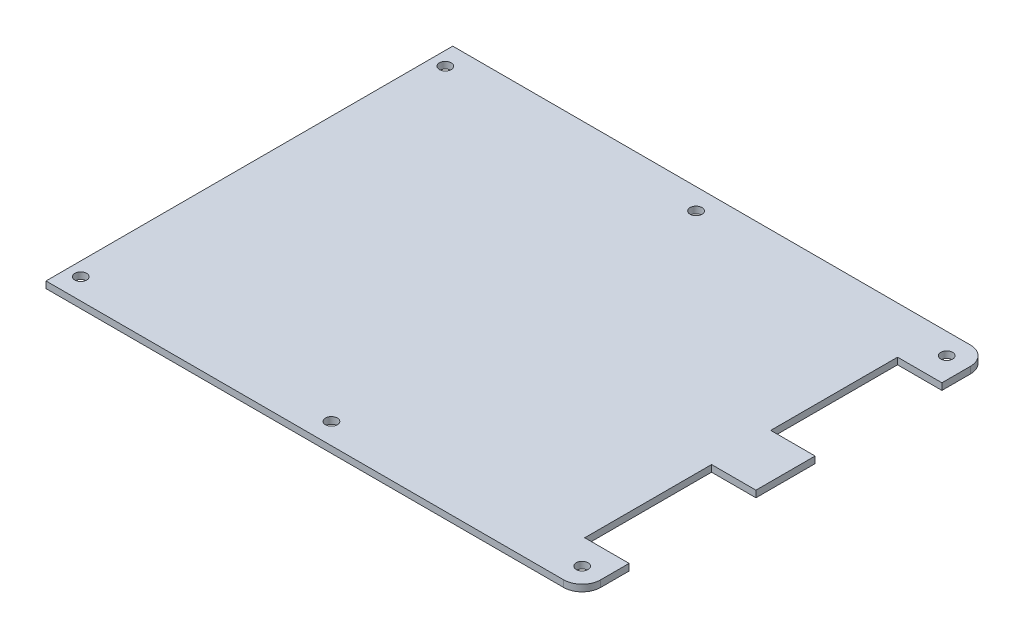
ISO-10303-21;
HEADER;
FILE_DESCRIPTION(('STEP AP214'),'2;1');
FILE_NAME('part.step','',(''),(''),'','','');
FILE_SCHEMA(('AUTOMOTIVE_DESIGN { 1 0 10303 214 1 1 1 1 }'));
ENDSEC;
DATA;
#1=APPLICATION_CONTEXT('core data for automotive mechanical design processes');
#2=APPLICATION_PROTOCOL_DEFINITION('international standard','automotive_design',2000,#1);
#3=PRODUCT_CONTEXT('',#1,'mechanical');
#4=PRODUCT('Part','Part','',(#3));
#5=PRODUCT_RELATED_PRODUCT_CATEGORY('part','',(#4));
#6=PRODUCT_DEFINITION_FORMATION('','',#4);
#7=PRODUCT_DEFINITION_CONTEXT('part definition',#1,'design');
#8=PRODUCT_DEFINITION('design','',#6,#7);
#9=PRODUCT_DEFINITION_SHAPE('','',#8);
#10=(LENGTH_UNIT() NAMED_UNIT(*) SI_UNIT(.MILLI.,.METRE.));
#11=(NAMED_UNIT(*) PLANE_ANGLE_UNIT() SI_UNIT($,.RADIAN.));
#12=(NAMED_UNIT(*) SI_UNIT($,.STERADIAN.) SOLID_ANGLE_UNIT());
#13=UNCERTAINTY_MEASURE_WITH_UNIT(LENGTH_MEASURE(1.E-05),#10,'distance_accuracy_value','');
#14=(GEOMETRIC_REPRESENTATION_CONTEXT(3) GLOBAL_UNCERTAINTY_ASSIGNED_CONTEXT((#13)) GLOBAL_UNIT_ASSIGNED_CONTEXT((#10,
#11,#12)) REPRESENTATION_CONTEXT('',''));
#15=CARTESIAN_POINT('',(0.,0.,0.));
#16=DIRECTION('',(0.,0.,1.));
#17=DIRECTION('',(1.,0.,0.));
#18=AXIS2_PLACEMENT_3D('',#15,#16,#17);
#19=CARTESIAN_POINT('',(72.5,1.8,-42.3));
#20=DIRECTION('',(-1.,0.,0.));
#21=DIRECTION('',(0.,0.,1.));
#22=AXIS2_PLACEMENT_3D('',#19,#20,#21);
#23=PLANE('',#22);
#24=DIRECTION('',(0.,0.,-1.));
#25=VECTOR('',#24,1.);
#26=CARTESIAN_POINT('',(72.5,0.,-42.3));
#27=LINE('',#26,#25);
#28=CARTESIAN_POINT('',(72.5,0.,-42.3));
#29=VERTEX_POINT('',#28);
#30=CARTESIAN_POINT('',(72.5,0.,-50.));
#31=VERTEX_POINT('',#30);
#32=EDGE_CURVE('E180',#29,#31,#27,.T.);
#33=ORIENTED_EDGE('',*,*,#32,.T.);
#34=DIRECTION('',(0.,-1.,0.));
#35=VECTOR('',#34,1.);
#36=CARTESIAN_POINT('',(72.5,1.8,-50.));
#37=LINE('',#36,#35);
#38=CARTESIAN_POINT('',(72.5,1.8,-50.));
#39=VERTEX_POINT('',#38);
#40=EDGE_CURVE('E234',#31,#39,#37,.F.);
#41=ORIENTED_EDGE('',*,*,#40,.T.);
#42=DIRECTION('',(0.,0.,-1.));
#43=VECTOR('',#42,1.);
#44=CARTESIAN_POINT('',(72.5,1.8,-42.3));
#45=LINE('',#44,#43);
#46=CARTESIAN_POINT('',(72.5,1.8,-42.3));
#47=VERTEX_POINT('',#46);
#48=EDGE_CURVE('E144',#47,#39,#45,.T.);
#49=ORIENTED_EDGE('',*,*,#48,.F.);
#50=DIRECTION('',(0.,-1.,0.));
#51=VECTOR('',#50,1.);
#52=CARTESIAN_POINT('',(72.5,1.8,-42.3));
#53=LINE('',#52,#51);
#54=EDGE_CURVE('E179',#47,#29,#53,.T.);
#55=ORIENTED_EDGE('',*,*,#54,.T.);
#56=EDGE_LOOP('',(#33,#41,#49,#55));
#57=FACE_BOUND('',#56,.T.);
#58=ADVANCED_FACE('F33',(#57),#23,.F.);
#59=CARTESIAN_POINT('',(-72.5,1.8,-55.));
#60=DIRECTION('',(0.,0.,1.));
#61=DIRECTION('',(1.,0.,0.));
#62=AXIS2_PLACEMENT_3D('',#59,#60,#61);
#63=PLANE('',#62);
#64=DIRECTION('',(-1.,0.,0.));
#65=VECTOR('',#64,1.);
#66=CARTESIAN_POINT('',(-72.5,1.8,-55.));
#67=LINE('',#66,#65);
#68=CARTESIAN_POINT('',(67.5,1.8,-55.));
#69=VERTEX_POINT('',#68);
#70=CARTESIAN_POINT('',(-72.5,1.8,-55.));
#71=VERTEX_POINT('',#70);
#72=EDGE_CURVE('E132',#69,#71,#67,.T.);
#73=ORIENTED_EDGE('',*,*,#72,.F.);
#74=DIRECTION('',(0.,-1.,0.));
#75=VECTOR('',#74,1.);
#76=CARTESIAN_POINT('',(67.5,1.8,-55.));
#77=LINE('',#76,#75);
#78=CARTESIAN_POINT('',(67.5,0.,-55.));
#79=VERTEX_POINT('',#78);
#80=EDGE_CURVE('E153',#69,#79,#77,.T.);
#81=ORIENTED_EDGE('',*,*,#80,.T.);
#82=DIRECTION('',(-1.,0.,0.));
#83=VECTOR('',#82,1.);
#84=CARTESIAN_POINT('',(-72.5,0.,-55.));
#85=LINE('',#84,#83);
#86=CARTESIAN_POINT('',(-72.5,0.,-55.));
#87=VERTEX_POINT('',#86);
#88=EDGE_CURVE('E150',#79,#87,#85,.T.);
#89=ORIENTED_EDGE('',*,*,#88,.T.);
#90=DIRECTION('',(0.,-1.,0.));
#91=VECTOR('',#90,1.);
#92=CARTESIAN_POINT('',(-72.5,1.8,-55.));
#93=LINE('',#92,#91);
#94=EDGE_CURVE('E147',#71,#87,#93,.T.);
#95=ORIENTED_EDGE('',*,*,#94,.F.);
#96=EDGE_LOOP('',(#73,#81,#89,#95));
#97=FACE_BOUND('',#96,.T.);
#98=ADVANCED_FACE('F148',(#97),#63,.F.);
#99=CARTESIAN_POINT('',(-72.5,1.8,55.));
#100=DIRECTION('',(1.,0.,0.));
#101=DIRECTION('',(0.,0.,-1.));
#102=AXIS2_PLACEMENT_3D('',#99,#100,#101);
#103=PLANE('',#102);
#104=DIRECTION('',(0.,0.,1.));
#105=VECTOR('',#104,1.);
#106=CARTESIAN_POINT('',(-72.5,0.,55.));
#107=LINE('',#106,#105);
#108=CARTESIAN_POINT('',(-72.5,0.,55.));
#109=VERTEX_POINT('',#108);
#110=EDGE_CURVE('E185',#87,#109,#107,.T.);
#111=ORIENTED_EDGE('',*,*,#110,.T.);
#112=DIRECTION('',(0.,-1.,0.));
#113=VECTOR('',#112,1.);
#114=CARTESIAN_POINT('',(-72.5,1.8,55.));
#115=LINE('',#114,#113);
#116=CARTESIAN_POINT('',(-72.5,1.8,55.));
#117=VERTEX_POINT('',#116);
#118=EDGE_CURVE('E154',#117,#109,#115,.T.);
#119=ORIENTED_EDGE('',*,*,#118,.F.);
#120=DIRECTION('',(0.,0.,1.));
#121=VECTOR('',#120,1.);
#122=CARTESIAN_POINT('',(-72.5,1.8,55.));
#123=LINE('',#122,#121);
#124=EDGE_CURVE('E137',#71,#117,#123,.T.);
#125=ORIENTED_EDGE('',*,*,#124,.F.);
#126=ORIENTED_EDGE('',*,*,#94,.T.);
#127=EDGE_LOOP('',(#111,#119,#125,#126));
#128=FACE_BOUND('',#127,.T.);
#129=ADVANCED_FACE('F156',(#128),#103,.F.);
#130=CARTESIAN_POINT('',(-72.5,1.8,55.));
#131=DIRECTION('',(0.,0.,-1.));
#132=DIRECTION('',(-1.,0.,0.));
#133=AXIS2_PLACEMENT_3D('',#130,#131,#132);
#134=PLANE('',#133);
#135=DIRECTION('',(1.,0.,0.));
#136=VECTOR('',#135,1.);
#137=CARTESIAN_POINT('',(-72.5,0.,55.));
#138=LINE('',#137,#136);
#139=CARTESIAN_POINT('',(67.5,0.,55.));
#140=VERTEX_POINT('',#139);
#141=EDGE_CURVE('E187',#109,#140,#138,.T.);
#142=ORIENTED_EDGE('',*,*,#141,.T.);
#143=DIRECTION('',(0.,-1.,0.));
#144=VECTOR('',#143,1.);
#145=CARTESIAN_POINT('',(67.5,1.8,55.));
#146=LINE('',#145,#144);
#147=CARTESIAN_POINT('',(67.5,1.8,55.));
#148=VERTEX_POINT('',#147);
#149=EDGE_CURVE('E11',#140,#148,#146,.F.);
#150=ORIENTED_EDGE('',*,*,#149,.T.);
#151=DIRECTION('',(1.,0.,0.));
#152=VECTOR('',#151,1.);
#153=CARTESIAN_POINT('',(-72.5,1.8,55.));
#154=LINE('',#153,#152);
#155=EDGE_CURVE('E158',#117,#148,#154,.T.);
#156=ORIENTED_EDGE('',*,*,#155,.F.);
#157=ORIENTED_EDGE('',*,*,#118,.T.);
#158=EDGE_LOOP('',(#142,#150,#156,#157));
#159=FACE_BOUND('',#158,.T.);
#160=ADVANCED_FACE('F360',(#159),#134,.F.);
#161=CARTESIAN_POINT('',(72.5,1.8,55.));
#162=DIRECTION('',(-1.,0.,0.));
#163=DIRECTION('',(0.,0.,1.));
#164=AXIS2_PLACEMENT_3D('',#161,#162,#163);
#165=PLANE('',#164);
#166=DIRECTION('',(0.,0.,-1.));
#167=VECTOR('',#166,1.);
#168=CARTESIAN_POINT('',(72.5,1.8,55.));
#169=LINE('',#168,#167);
#170=CARTESIAN_POINT('',(72.5,1.8,50.));
#171=VERTEX_POINT('',#170);
#172=CARTESIAN_POINT('',(72.5,1.8,42.3));
#173=VERTEX_POINT('',#172);
#174=EDGE_CURVE('E160',#171,#173,#169,.T.);
#175=ORIENTED_EDGE('',*,*,#174,.F.);
#176=DIRECTION('',(0.,-1.,0.));
#177=VECTOR('',#176,1.);
#178=CARTESIAN_POINT('',(72.5,1.8,50.));
#179=LINE('',#178,#177);
#180=CARTESIAN_POINT('',(72.5,0.,50.));
#181=VERTEX_POINT('',#180);
#182=EDGE_CURVE('E41',#171,#181,#179,.T.);
#183=ORIENTED_EDGE('',*,*,#182,.T.);
#184=DIRECTION('',(0.,0.,-1.));
#185=VECTOR('',#184,1.);
#186=CARTESIAN_POINT('',(72.5,0.,55.));
#187=LINE('',#186,#185);
#188=CARTESIAN_POINT('',(72.5,0.,42.3));
#189=VERTEX_POINT('',#188);
#190=EDGE_CURVE('E189',#181,#189,#187,.T.);
#191=ORIENTED_EDGE('',*,*,#190,.T.);
#192=DIRECTION('',(0.,-1.,0.));
#193=VECTOR('',#192,1.);
#194=CARTESIAN_POINT('',(72.5,1.8,42.3));
#195=LINE('',#194,#193);
#196=EDGE_CURVE('E225',#173,#189,#195,.T.);
#197=ORIENTED_EDGE('',*,*,#196,.F.);
#198=EDGE_LOOP('',(#175,#183,#191,#197));
#199=FACE_BOUND('',#198,.T.);
#200=ADVANCED_FACE('F241',(#199),#165,.F.);
#201=CARTESIAN_POINT('',(72.5,1.8,42.3));
#202=DIRECTION('',(0.,0.,1.));
#203=DIRECTION('',(1.,0.,0.));
#204=AXIS2_PLACEMENT_3D('',#201,#202,#203);
#205=PLANE('',#204);
#206=DIRECTION('',(-1.,0.,0.));
#207=VECTOR('',#206,1.);
#208=CARTESIAN_POINT('',(72.5,0.,42.3));
#209=LINE('',#208,#207);
#210=CARTESIAN_POINT('',(60.5,0.,42.3));
#211=VERTEX_POINT('',#210);
#212=EDGE_CURVE('E191',#189,#211,#209,.T.);
#213=ORIENTED_EDGE('',*,*,#212,.T.);
#214=DIRECTION('',(0.,-1.,0.));
#215=VECTOR('',#214,1.);
#216=CARTESIAN_POINT('',(60.5,1.8,42.3));
#217=LINE('',#216,#215);
#218=CARTESIAN_POINT('',(60.5,1.8,42.3));
#219=VERTEX_POINT('',#218);
#220=EDGE_CURVE('E222',#219,#211,#217,.T.);
#221=ORIENTED_EDGE('',*,*,#220,.F.);
#222=DIRECTION('',(-1.,0.,0.));
#223=VECTOR('',#222,1.);
#224=CARTESIAN_POINT('',(72.5,1.8,42.3));
#225=LINE('',#224,#223);
#226=EDGE_CURVE('E165',#173,#219,#225,.T.);
#227=ORIENTED_EDGE('',*,*,#226,.F.);
#228=ORIENTED_EDGE('',*,*,#196,.T.);
#229=EDGE_LOOP('',(#213,#221,#227,#228));
#230=FACE_BOUND('',#229,.T.);
#231=ADVANCED_FACE('F252',(#230),#205,.F.);
#232=CARTESIAN_POINT('',(60.5,1.8,42.3));
#233=DIRECTION('',(-1.,0.,0.));
#234=DIRECTION('',(0.,0.,1.));
#235=AXIS2_PLACEMENT_3D('',#232,#233,#234);
#236=PLANE('',#235);
#237=DIRECTION('',(0.,0.,-1.));
#238=VECTOR('',#237,1.);
#239=CARTESIAN_POINT('',(60.5,0.,42.3));
#240=LINE('',#239,#238);
#241=CARTESIAN_POINT('',(60.5,0.,8.));
#242=VERTEX_POINT('',#241);
#243=EDGE_CURVE('E193',#211,#242,#240,.T.);
#244=ORIENTED_EDGE('',*,*,#243,.T.);
#245=DIRECTION('',(0.,-1.,0.));
#246=VECTOR('',#245,1.);
#247=CARTESIAN_POINT('',(60.5,1.8,8.));
#248=LINE('',#247,#246);
#249=CARTESIAN_POINT('',(60.5,1.8,8.));
#250=VERTEX_POINT('',#249);
#251=EDGE_CURVE('E219',#250,#242,#248,.T.);
#252=ORIENTED_EDGE('',*,*,#251,.F.);
#253=DIRECTION('',(0.,0.,-1.));
#254=VECTOR('',#253,1.);
#255=CARTESIAN_POINT('',(60.5,1.8,42.3));
#256=LINE('',#255,#254);
#257=EDGE_CURVE('E167',#219,#250,#256,.T.);
#258=ORIENTED_EDGE('',*,*,#257,.F.);
#259=ORIENTED_EDGE('',*,*,#220,.T.);
#260=EDGE_LOOP('',(#244,#252,#258,#259));
#261=FACE_BOUND('',#260,.T.);
#262=ADVANCED_FACE('F256',(#261),#236,.F.);
#263=CARTESIAN_POINT('',(72.5,1.8,8.));
#264=DIRECTION('',(0.,0.,-1.));
#265=DIRECTION('',(-1.,0.,0.));
#266=AXIS2_PLACEMENT_3D('',#263,#264,#265);
#267=PLANE('',#266);
#268=DIRECTION('',(1.,0.,0.));
#269=VECTOR('',#268,1.);
#270=CARTESIAN_POINT('',(72.5,0.,8.));
#271=LINE('',#270,#269);
#272=CARTESIAN_POINT('',(72.5,0.,8.));
#273=VERTEX_POINT('',#272);
#274=EDGE_CURVE('E195',#242,#273,#271,.T.);
#275=ORIENTED_EDGE('',*,*,#274,.T.);
#276=DIRECTION('',(0.,-1.,0.));
#277=VECTOR('',#276,1.);
#278=CARTESIAN_POINT('',(72.5,1.8,8.));
#279=LINE('',#278,#277);
#280=CARTESIAN_POINT('',(72.5,1.8,8.));
#281=VERTEX_POINT('',#280);
#282=EDGE_CURVE('E216',#281,#273,#279,.T.);
#283=ORIENTED_EDGE('',*,*,#282,.F.);
#284=DIRECTION('',(1.,0.,0.));
#285=VECTOR('',#284,1.);
#286=CARTESIAN_POINT('',(72.5,1.8,8.));
#287=LINE('',#286,#285);
#288=EDGE_CURVE('E169',#250,#281,#287,.T.);
#289=ORIENTED_EDGE('',*,*,#288,.F.);
#290=ORIENTED_EDGE('',*,*,#251,.T.);
#291=EDGE_LOOP('',(#275,#283,#289,#290));
#292=FACE_BOUND('',#291,.T.);
#293=ADVANCED_FACE('F263',(#292),#267,.F.);
#294=CARTESIAN_POINT('',(72.5,1.8,8.));
#295=DIRECTION('',(-1.,0.,0.));
#296=DIRECTION('',(0.,0.,1.));
#297=AXIS2_PLACEMENT_3D('',#294,#295,#296);
#298=PLANE('',#297);
#299=DIRECTION('',(0.,0.,-1.));
#300=VECTOR('',#299,1.);
#301=CARTESIAN_POINT('',(72.5,0.,8.));
#302=LINE('',#301,#300);
#303=CARTESIAN_POINT('',(72.5,0.,-8.));
#304=VERTEX_POINT('',#303);
#305=EDGE_CURVE('E197',#273,#304,#302,.T.);
#306=ORIENTED_EDGE('',*,*,#305,.T.);
#307=DIRECTION('',(0.,-1.,0.));
#308=VECTOR('',#307,1.);
#309=CARTESIAN_POINT('',(72.5,1.8,-8.));
#310=LINE('',#309,#308);
#311=CARTESIAN_POINT('',(72.5,1.8,-8.));
#312=VERTEX_POINT('',#311);
#313=EDGE_CURVE('E213',#312,#304,#310,.T.);
#314=ORIENTED_EDGE('',*,*,#313,.F.);
#315=DIRECTION('',(0.,0.,-1.));
#316=VECTOR('',#315,1.);
#317=CARTESIAN_POINT('',(72.5,1.8,8.));
#318=LINE('',#317,#316);
#319=EDGE_CURVE('E171',#281,#312,#318,.T.);
#320=ORIENTED_EDGE('',*,*,#319,.F.);
#321=ORIENTED_EDGE('',*,*,#282,.T.);
#322=EDGE_LOOP('',(#306,#314,#320,#321));
#323=FACE_BOUND('',#322,.T.);
#324=ADVANCED_FACE('F266',(#323),#298,.F.);
#325=CARTESIAN_POINT('',(72.5,1.8,-8.));
#326=DIRECTION('',(0.,0.,1.));
#327=DIRECTION('',(1.,0.,0.));
#328=AXIS2_PLACEMENT_3D('',#325,#326,#327);
#329=PLANE('',#328);
#330=DIRECTION('',(-1.,0.,0.));
#331=VECTOR('',#330,1.);
#332=CARTESIAN_POINT('',(72.5,0.,-8.));
#333=LINE('',#332,#331);
#334=CARTESIAN_POINT('',(60.5,0.,-8.));
#335=VERTEX_POINT('',#334);
#336=EDGE_CURVE('E199',#304,#335,#333,.T.);
#337=ORIENTED_EDGE('',*,*,#336,.T.);
#338=DIRECTION('',(0.,-1.,0.));
#339=VECTOR('',#338,1.);
#340=CARTESIAN_POINT('',(60.5,1.8,-8.));
#341=LINE('',#340,#339);
#342=CARTESIAN_POINT('',(60.5,1.8,-8.));
#343=VERTEX_POINT('',#342);
#344=EDGE_CURVE('E210',#343,#335,#341,.T.);
#345=ORIENTED_EDGE('',*,*,#344,.F.);
#346=DIRECTION('',(-1.,0.,0.));
#347=VECTOR('',#346,1.);
#348=CARTESIAN_POINT('',(72.5,1.8,-8.));
#349=LINE('',#348,#347);
#350=EDGE_CURVE('E173',#312,#343,#349,.T.);
#351=ORIENTED_EDGE('',*,*,#350,.F.);
#352=ORIENTED_EDGE('',*,*,#313,.T.);
#353=EDGE_LOOP('',(#337,#345,#351,#352));
#354=FACE_BOUND('',#353,.T.);
#355=ADVANCED_FACE('F271',(#354),#329,.F.);
#356=CARTESIAN_POINT('',(60.5,1.8,-42.3));
#357=DIRECTION('',(-1.,0.,0.));
#358=DIRECTION('',(0.,0.,1.));
#359=AXIS2_PLACEMENT_3D('',#356,#357,#358);
#360=PLANE('',#359);
#361=DIRECTION('',(0.,0.,-1.));
#362=VECTOR('',#361,1.);
#363=CARTESIAN_POINT('',(60.5,0.,-42.3));
#364=LINE('',#363,#362);
#365=CARTESIAN_POINT('',(60.5,0.,-42.3));
#366=VERTEX_POINT('',#365);
#367=EDGE_CURVE('E201',#335,#366,#364,.T.);
#368=ORIENTED_EDGE('',*,*,#367,.T.);
#369=DIRECTION('',(0.,-1.,0.));
#370=VECTOR('',#369,1.);
#371=CARTESIAN_POINT('',(60.5,1.8,-42.3));
#372=LINE('',#371,#370);
#373=CARTESIAN_POINT('',(60.5,1.8,-42.3));
#374=VERTEX_POINT('',#373);
#375=EDGE_CURVE('E207',#374,#366,#372,.T.);
#376=ORIENTED_EDGE('',*,*,#375,.F.);
#377=DIRECTION('',(0.,0.,-1.));
#378=VECTOR('',#377,1.);
#379=CARTESIAN_POINT('',(60.5,1.8,-42.3));
#380=LINE('',#379,#378);
#381=EDGE_CURVE('E175',#343,#374,#380,.T.);
#382=ORIENTED_EDGE('',*,*,#381,.F.);
#383=ORIENTED_EDGE('',*,*,#344,.T.);
#384=EDGE_LOOP('',(#368,#376,#382,#383));
#385=FACE_BOUND('',#384,.T.);
#386=ADVANCED_FACE('F277',(#385),#360,.F.);
#387=CARTESIAN_POINT('',(72.5,1.8,-42.3));
#388=DIRECTION('',(0.,0.,-1.));
#389=DIRECTION('',(-1.,0.,0.));
#390=AXIS2_PLACEMENT_3D('',#387,#388,#389);
#391=PLANE('',#390);
#392=DIRECTION('',(1.,0.,0.));
#393=VECTOR('',#392,1.);
#394=CARTESIAN_POINT('',(72.5,0.,-42.3));
#395=LINE('',#394,#393);
#396=EDGE_CURVE('E203',#366,#29,#395,.T.);
#397=ORIENTED_EDGE('',*,*,#396,.T.);
#398=ORIENTED_EDGE('',*,*,#54,.F.);
#399=DIRECTION('',(1.,0.,0.));
#400=VECTOR('',#399,1.);
#401=CARTESIAN_POINT('',(72.5,1.8,-42.3));
#402=LINE('',#401,#400);
#403=EDGE_CURVE('E177',#374,#47,#402,.T.);
#404=ORIENTED_EDGE('',*,*,#403,.F.);
#405=ORIENTED_EDGE('',*,*,#375,.T.);
#406=EDGE_LOOP('',(#397,#398,#404,#405));
#407=FACE_BOUND('',#406,.T.);
#408=ADVANCED_FACE('F281',(#407),#391,.F.);
#409=CARTESIAN_POINT('',(0.,1.8,0.));
#410=DIRECTION('',(0.,-1.,0.));
#411=DIRECTION('',(0.,0.,-1.));
#412=AXIS2_PLACEMENT_3D('',#409,#410,#411);
#413=PLANE('',#412);
#414=CARTESIAN_POINT('',(66.8,1.8,-49.3));
#415=DIRECTION('',(0.,1.,0.));
#416=DIRECTION('',(0.,0.,1.));
#417=AXIS2_PLACEMENT_3D('',#414,#415,#416);
#418=CIRCLE('',#417,1.60000000000001);
#419=CARTESIAN_POINT('',(66.8,1.8,-47.7));
#420=VERTEX_POINT('',#419);
#421=EDGE_CURVE('E308',#420,#420,#418,.T.);
#422=ORIENTED_EDGE('',*,*,#421,.F.);
#423=EDGE_LOOP('',(#422));
#424=FACE_BOUND('',#423,.T.);
#425=CARTESIAN_POINT('',(-68.8,1.8,49.3));
#426=DIRECTION('',(0.,1.,0.));
#427=DIRECTION('',(0.,0.,1.));
#428=AXIS2_PLACEMENT_3D('',#425,#426,#427);
#429=CIRCLE('',#428,1.60000000000001);
#430=CARTESIAN_POINT('',(-68.8,1.8,50.9));
#431=VERTEX_POINT('',#430);
#432=EDGE_CURVE('E297',#431,#431,#429,.T.);
#433=ORIENTED_EDGE('',*,*,#432,.F.);
#434=EDGE_LOOP('',(#433));
#435=FACE_BOUND('',#434,.T.);
#436=CARTESIAN_POINT('',(-0.999999999999987,1.8,49.3));
#437=DIRECTION('',(0.,1.,0.));
#438=DIRECTION('',(0.,0.,1.));
#439=AXIS2_PLACEMENT_3D('',#436,#437,#438);
#440=CIRCLE('',#439,1.6);
#441=CARTESIAN_POINT('',(-0.999999999999987,1.8,50.9));
#442=VERTEX_POINT('',#441);
#443=EDGE_CURVE('E296',#442,#442,#440,.T.);
#444=ORIENTED_EDGE('',*,*,#443,.F.);
#445=EDGE_LOOP('',(#444));
#446=FACE_BOUND('',#445,.T.);
#447=CARTESIAN_POINT('',(-1.,1.8,-49.3));
#448=DIRECTION('',(0.,1.,0.));
#449=DIRECTION('',(0.,0.,1.));
#450=AXIS2_PLACEMENT_3D('',#447,#448,#449);
#451=CIRCLE('',#450,1.6);
#452=CARTESIAN_POINT('',(-1.,1.8,-47.7));
#453=VERTEX_POINT('',#452);
#454=EDGE_CURVE('E290',#453,#453,#451,.T.);
#455=ORIENTED_EDGE('',*,*,#454,.F.);
#456=EDGE_LOOP('',(#455));
#457=FACE_BOUND('',#456,.T.);
#458=CARTESIAN_POINT('',(66.8,1.8,49.3));
#459=DIRECTION('',(0.,1.,0.));
#460=DIRECTION('',(0.,0.,1.));
#461=AXIS2_PLACEMENT_3D('',#458,#459,#460);
#462=CIRCLE('',#461,1.60000000000001);
#463=CARTESIAN_POINT('',(66.8,1.8,50.9));
#464=VERTEX_POINT('',#463);
#465=EDGE_CURVE('E309',#464,#464,#462,.T.);
#466=ORIENTED_EDGE('',*,*,#465,.F.);
#467=EDGE_LOOP('',(#466));
#468=FACE_BOUND('',#467,.T.);
#469=CARTESIAN_POINT('',(-68.8,1.8,-49.3));
#470=DIRECTION('',(0.,1.,0.));
#471=DIRECTION('',(0.,0.,1.));
#472=AXIS2_PLACEMENT_3D('',#469,#470,#471);
#473=CIRCLE('',#472,1.60000000000001);
#474=CARTESIAN_POINT('',(-68.8,1.8,-47.7));
#475=VERTEX_POINT('',#474);
#476=EDGE_CURVE('E183',#475,#475,#473,.T.);
#477=ORIENTED_EDGE('',*,*,#476,.F.);
#478=EDGE_LOOP('',(#477));
#479=FACE_BOUND('',#478,.T.);
#480=ORIENTED_EDGE('',*,*,#48,.T.);
#481=CARTESIAN_POINT('',(67.5,1.8,-50.));
#482=DIRECTION('',(0.,-1.,0.));
#483=DIRECTION('',(0.,0.,-1.));
#484=AXIS2_PLACEMENT_3D('',#481,#482,#483);
#485=CIRCLE('',#484,5.);
#486=EDGE_CURVE('E140',#39,#69,#485,.F.);
#487=ORIENTED_EDGE('',*,*,#486,.T.);
#488=ORIENTED_EDGE('',*,*,#72,.T.);
#489=ORIENTED_EDGE('',*,*,#124,.T.);
#490=ORIENTED_EDGE('',*,*,#155,.T.);
#491=CARTESIAN_POINT('',(67.5,1.8,50.));
#492=DIRECTION('',(0.,-1.,0.));
#493=DIRECTION('',(0.,0.,-1.));
#494=AXIS2_PLACEMENT_3D('',#491,#492,#493);
#495=CIRCLE('',#494,5.);
#496=EDGE_CURVE('E48',#148,#171,#495,.F.);
#497=ORIENTED_EDGE('',*,*,#496,.T.);
#498=ORIENTED_EDGE('',*,*,#174,.T.);
#499=ORIENTED_EDGE('',*,*,#226,.T.);
#500=ORIENTED_EDGE('',*,*,#257,.T.);
#501=ORIENTED_EDGE('',*,*,#288,.T.);
#502=ORIENTED_EDGE('',*,*,#319,.T.);
#503=ORIENTED_EDGE('',*,*,#350,.T.);
#504=ORIENTED_EDGE('',*,*,#381,.T.);
#505=ORIENTED_EDGE('',*,*,#403,.T.);
#506=EDGE_LOOP('',(#480,#487,#488,#489,#490,#497,#498,#499,#500,#501,#502,#503,#504,#505));
#507=FACE_BOUND('',#506,.T.);
#508=ADVANCED_FACE('F135',(#424,#435,#446,#457,#468,#479,#507),#413,.F.);
#509=CARTESIAN_POINT('',(0.,0.,0.));
#510=DIRECTION('',(0.,-1.,0.));
#511=DIRECTION('',(0.,0.,-1.));
#512=AXIS2_PLACEMENT_3D('',#509,#510,#511);
#513=PLANE('',#512);
#514=CARTESIAN_POINT('',(66.8,0.,-49.3));
#515=DIRECTION('',(0.,-1.,0.));
#516=DIRECTION('',(0.,0.,-1.));
#517=AXIS2_PLACEMENT_3D('',#514,#515,#516);
#518=CIRCLE('',#517,1.60000000000001);
#519=CARTESIAN_POINT('',(66.8,0.,-50.9));
#520=VERTEX_POINT('',#519);
#521=EDGE_CURVE('E305',#520,#520,#518,.F.);
#522=ORIENTED_EDGE('',*,*,#521,.T.);
#523=EDGE_LOOP('',(#522));
#524=FACE_BOUND('',#523,.T.);
#525=CARTESIAN_POINT('',(-68.8,0.,49.3));
#526=DIRECTION('',(0.,-1.,0.));
#527=DIRECTION('',(0.,0.,-1.));
#528=AXIS2_PLACEMENT_3D('',#525,#526,#527);
#529=CIRCLE('',#528,1.60000000000001);
#530=CARTESIAN_POINT('',(-68.8,0.,47.7));
#531=VERTEX_POINT('',#530);
#532=EDGE_CURVE('E312',#531,#531,#529,.F.);
#533=ORIENTED_EDGE('',*,*,#532,.T.);
#534=EDGE_LOOP('',(#533));
#535=FACE_BOUND('',#534,.T.);
#536=CARTESIAN_POINT('',(-0.999999999999987,0.,49.3));
#537=DIRECTION('',(0.,-1.,0.));
#538=DIRECTION('',(0.,0.,-1.));
#539=AXIS2_PLACEMENT_3D('',#536,#537,#538);
#540=CIRCLE('',#539,1.6);
#541=CARTESIAN_POINT('',(-0.999999999999987,0.,47.7));
#542=VERTEX_POINT('',#541);
#543=EDGE_CURVE('E293',#542,#542,#540,.F.);
#544=ORIENTED_EDGE('',*,*,#543,.T.);
#545=EDGE_LOOP('',(#544));
#546=FACE_BOUND('',#545,.T.);
#547=CARTESIAN_POINT('',(-1.,0.,-49.3));
#548=DIRECTION('',(0.,-1.,0.));
#549=DIRECTION('',(0.,0.,-1.));
#550=AXIS2_PLACEMENT_3D('',#547,#548,#549);
#551=CIRCLE('',#550,1.6);
#552=CARTESIAN_POINT('',(-1.,0.,-50.9));
#553=VERTEX_POINT('',#552);
#554=EDGE_CURVE('E300',#553,#553,#551,.F.);
#555=ORIENTED_EDGE('',*,*,#554,.T.);
#556=EDGE_LOOP('',(#555));
#557=FACE_BOUND('',#556,.T.);
#558=CARTESIAN_POINT('',(66.8,0.,49.3));
#559=DIRECTION('',(0.,-1.,0.));
#560=DIRECTION('',(0.,0.,-1.));
#561=AXIS2_PLACEMENT_3D('',#558,#559,#560);
#562=CIRCLE('',#561,1.60000000000001);
#563=CARTESIAN_POINT('',(66.8,0.,47.7));
#564=VERTEX_POINT('',#563);
#565=EDGE_CURVE('E317',#564,#564,#562,.F.);
#566=ORIENTED_EDGE('',*,*,#565,.T.);
#567=EDGE_LOOP('',(#566));
#568=FACE_BOUND('',#567,.T.);
#569=CARTESIAN_POINT('',(-68.8,0.,-49.3));
#570=DIRECTION('',(0.,-1.,0.));
#571=DIRECTION('',(0.,0.,-1.));
#572=AXIS2_PLACEMENT_3D('',#569,#570,#571);
#573=CIRCLE('',#572,1.60000000000001);
#574=CARTESIAN_POINT('',(-68.8,0.,-50.9));
#575=VERTEX_POINT('',#574);
#576=EDGE_CURVE('E287',#575,#575,#573,.F.);
#577=ORIENTED_EDGE('',*,*,#576,.T.);
#578=EDGE_LOOP('',(#577));
#579=FACE_BOUND('',#578,.T.);
#580=ORIENTED_EDGE('',*,*,#88,.F.);
#581=CARTESIAN_POINT('',(67.5,0.,-50.));
#582=DIRECTION('',(0.,-1.,0.));
#583=DIRECTION('',(0.,0.,-1.));
#584=AXIS2_PLACEMENT_3D('',#581,#582,#583);
#585=CIRCLE('',#584,5.);
#586=EDGE_CURVE('E232',#79,#31,#585,.T.);
#587=ORIENTED_EDGE('',*,*,#586,.T.);
#588=ORIENTED_EDGE('',*,*,#32,.F.);
#589=ORIENTED_EDGE('',*,*,#396,.F.);
#590=ORIENTED_EDGE('',*,*,#367,.F.);
#591=ORIENTED_EDGE('',*,*,#336,.F.);
#592=ORIENTED_EDGE('',*,*,#305,.F.);
#593=ORIENTED_EDGE('',*,*,#274,.F.);
#594=ORIENTED_EDGE('',*,*,#243,.F.);
#595=ORIENTED_EDGE('',*,*,#212,.F.);
#596=ORIENTED_EDGE('',*,*,#190,.F.);
#597=CARTESIAN_POINT('',(67.5,0.,50.));
#598=DIRECTION('',(0.,-1.,0.));
#599=DIRECTION('',(0.,0.,-1.));
#600=AXIS2_PLACEMENT_3D('',#597,#598,#599);
#601=CIRCLE('',#600,5.);
#602=EDGE_CURVE('E230',#181,#140,#601,.T.);
#603=ORIENTED_EDGE('',*,*,#602,.T.);
#604=ORIENTED_EDGE('',*,*,#141,.F.);
#605=ORIENTED_EDGE('',*,*,#110,.F.);
#606=EDGE_LOOP('',(#580,#587,#588,#589,#590,#591,#592,#593,#594,#595,#596,#603,#604,#605));
#607=FACE_BOUND('',#606,.T.);
#608=ADVANCED_FACE('F246',(#524,#535,#546,#557,#568,#579,#607),#513,.T.);
#609=CARTESIAN_POINT('',(67.5,1.8,-50.));
#610=DIRECTION('',(0.,-1.,0.));
#611=DIRECTION('',(0.,0.,-1.));
#612=AXIS2_PLACEMENT_3D('',#609,#610,#611);
#613=CYLINDRICAL_SURFACE('',#612,5.);
#614=ORIENTED_EDGE('',*,*,#486,.F.);
#615=ORIENTED_EDGE('',*,*,#40,.F.);
#616=ORIENTED_EDGE('',*,*,#586,.F.);
#617=ORIENTED_EDGE('',*,*,#80,.F.);
#618=EDGE_LOOP('',(#614,#615,#616,#617));
#619=FACE_BOUND('',#618,.T.);
#620=ADVANCED_FACE('F342',(#619),#613,.T.);
#621=CARTESIAN_POINT('',(67.5,1.8,50.));
#622=DIRECTION('',(0.,-1.,0.));
#623=DIRECTION('',(0.,0.,-1.));
#624=AXIS2_PLACEMENT_3D('',#621,#622,#623);
#625=CYLINDRICAL_SURFACE('',#624,5.);
#626=ORIENTED_EDGE('',*,*,#496,.F.);
#627=ORIENTED_EDGE('',*,*,#149,.F.);
#628=ORIENTED_EDGE('',*,*,#602,.F.);
#629=ORIENTED_EDGE('',*,*,#182,.F.);
#630=EDGE_LOOP('',(#626,#627,#628,#629));
#631=FACE_BOUND('',#630,.T.);
#632=ADVANCED_FACE('F35',(#631),#625,.T.);
#633=CARTESIAN_POINT('',(-68.8,-0.000999999999999916,-49.3));
#634=DIRECTION('',(0.,1.,0.));
#635=DIRECTION('',(0.,0.,1.));
#636=AXIS2_PLACEMENT_3D('',#633,#634,#635);
#637=CYLINDRICAL_SURFACE('',#636,1.60000000000001);
#638=ORIENTED_EDGE('',*,*,#576,.F.);
#639=EDGE_LOOP('',(#638));
#640=FACE_BOUND('',#639,.T.);
#641=ORIENTED_EDGE('',*,*,#476,.T.);
#642=EDGE_LOOP('',(#641));
#643=FACE_BOUND('',#642,.T.);
#644=ADVANCED_FACE('F331',(#640,#643),#637,.F.);
#645=CARTESIAN_POINT('',(66.8,-0.000999999999999916,49.3));
#646=DIRECTION('',(0.,1.,0.));
#647=DIRECTION('',(0.,0.,1.));
#648=AXIS2_PLACEMENT_3D('',#645,#646,#647);
#649=CYLINDRICAL_SURFACE('',#648,1.60000000000001);
#650=ORIENTED_EDGE('',*,*,#565,.F.);
#651=EDGE_LOOP('',(#650));
#652=FACE_BOUND('',#651,.T.);
#653=ORIENTED_EDGE('',*,*,#465,.T.);
#654=EDGE_LOOP('',(#653));
#655=FACE_BOUND('',#654,.T.);
#656=ADVANCED_FACE('F323',(#652,#655),#649,.F.);
#657=CARTESIAN_POINT('',(-1.,-0.000999999999999916,-49.3));
#658=DIRECTION('',(0.,1.,0.));
#659=DIRECTION('',(0.,0.,1.));
#660=AXIS2_PLACEMENT_3D('',#657,#658,#659);
#661=CYLINDRICAL_SURFACE('',#660,1.6);
#662=ORIENTED_EDGE('',*,*,#554,.F.);
#663=EDGE_LOOP('',(#662));
#664=FACE_BOUND('',#663,.T.);
#665=ORIENTED_EDGE('',*,*,#454,.T.);
#666=EDGE_LOOP('',(#665));
#667=FACE_BOUND('',#666,.T.);
#668=ADVANCED_FACE('F339',(#664,#667),#661,.F.);
#669=CARTESIAN_POINT('',(-0.999999999999987,-0.000999999999999916,49.3));
#670=DIRECTION('',(0.,1.,0.));
#671=DIRECTION('',(0.,0.,1.));
#672=AXIS2_PLACEMENT_3D('',#669,#670,#671);
#673=CYLINDRICAL_SURFACE('',#672,1.6);
#674=ORIENTED_EDGE('',*,*,#543,.F.);
#675=EDGE_LOOP('',(#674));
#676=FACE_BOUND('',#675,.T.);
#677=ORIENTED_EDGE('',*,*,#443,.T.);
#678=EDGE_LOOP('',(#677));
#679=FACE_BOUND('',#678,.T.);
#680=ADVANCED_FACE('F417',(#676,#679),#673,.F.);
#681=CARTESIAN_POINT('',(-68.8,-0.000999999999999916,49.3));
#682=DIRECTION('',(0.,1.,0.));
#683=DIRECTION('',(0.,0.,1.));
#684=AXIS2_PLACEMENT_3D('',#681,#682,#683);
#685=CYLINDRICAL_SURFACE('',#684,1.60000000000001);
#686=ORIENTED_EDGE('',*,*,#532,.F.);
#687=EDGE_LOOP('',(#686));
#688=FACE_BOUND('',#687,.T.);
#689=ORIENTED_EDGE('',*,*,#432,.T.);
#690=EDGE_LOOP('',(#689));
#691=FACE_BOUND('',#690,.T.);
#692=ADVANCED_FACE('F427',(#688,#691),#685,.F.);
#693=CARTESIAN_POINT('',(66.8,-0.000999999999999916,-49.3));
#694=DIRECTION('',(0.,1.,0.));
#695=DIRECTION('',(0.,0.,1.));
#696=AXIS2_PLACEMENT_3D('',#693,#694,#695);
#697=CYLINDRICAL_SURFACE('',#696,1.60000000000001);
#698=ORIENTED_EDGE('',*,*,#521,.F.);
#699=EDGE_LOOP('',(#698));
#700=FACE_BOUND('',#699,.T.);
#701=ORIENTED_EDGE('',*,*,#421,.T.);
#702=EDGE_LOOP('',(#701));
#703=FACE_BOUND('',#702,.T.);
#704=ADVANCED_FACE('F436',(#700,#703),#697,.F.);
#705=CLOSED_SHELL('',(#58,#98,#129,#160,#200,#231,#262,#293,#324,#355,#386,#408,#508,#608,#620,
#632,#644,#656,#668,#680,#692,#704));
#706=MANIFOLD_SOLID_BREP('B2',#705);
#707=ADVANCED_BREP_SHAPE_REPRESENTATION('',(#18,#706),#14);
#708=SHAPE_DEFINITION_REPRESENTATION(#9,#707);
ENDSEC;
END-ISO-10303-21;
